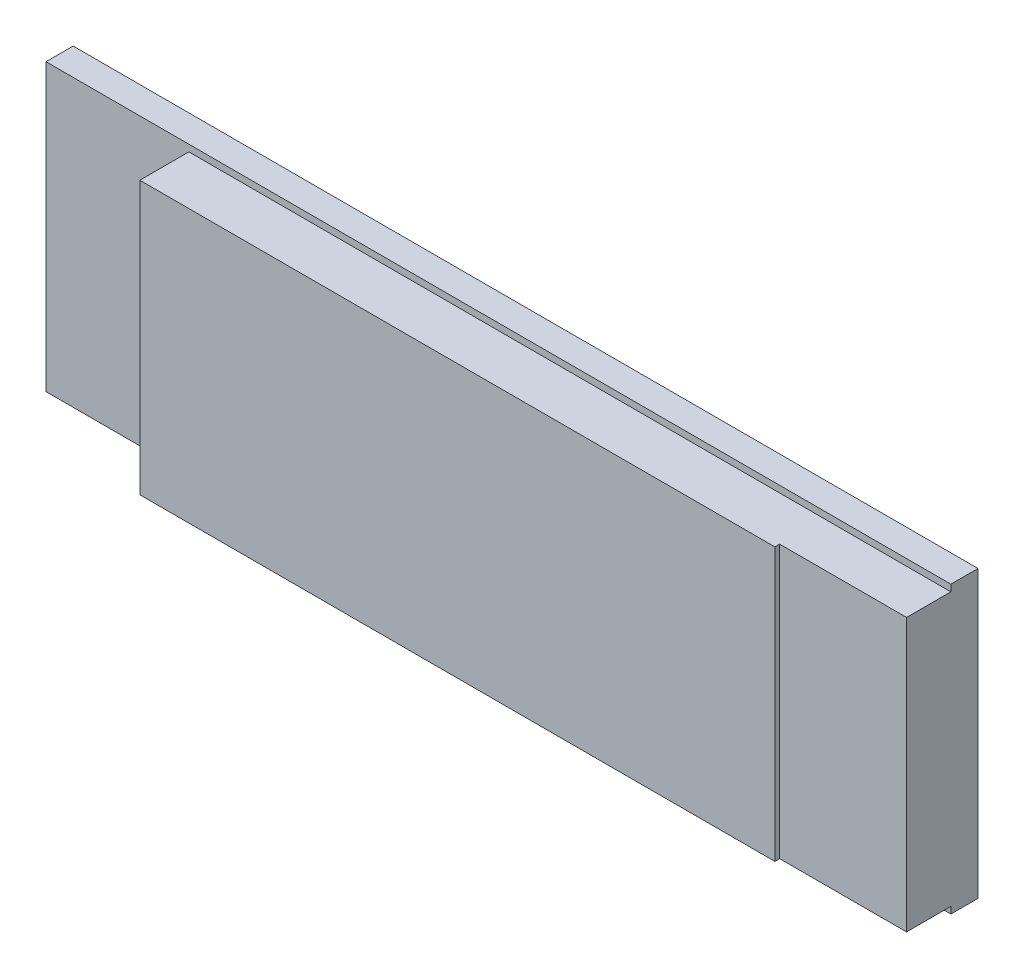
ISO-10303-21;
HEADER;
FILE_DESCRIPTION(('STEP AP214'),'2;1');
FILE_NAME('part.step','',(''),(''),'','','');
FILE_SCHEMA(('AUTOMOTIVE_DESIGN { 1 0 10303 214 1 1 1 1 }'));
ENDSEC;
DATA;
#1=APPLICATION_CONTEXT('core data for automotive mechanical design processes');
#2=APPLICATION_PROTOCOL_DEFINITION('international standard','automotive_design',2000,#1);
#3=PRODUCT_CONTEXT('',#1,'mechanical');
#4=PRODUCT('Part','Part','',(#3));
#5=PRODUCT_RELATED_PRODUCT_CATEGORY('part','',(#4));
#6=PRODUCT_DEFINITION_FORMATION('','',#4);
#7=PRODUCT_DEFINITION_CONTEXT('part definition',#1,'design');
#8=PRODUCT_DEFINITION('design','',#6,#7);
#9=PRODUCT_DEFINITION_SHAPE('','',#8);
#10=(LENGTH_UNIT() NAMED_UNIT(*) SI_UNIT(.MILLI.,.METRE.));
#11=(NAMED_UNIT(*) PLANE_ANGLE_UNIT() SI_UNIT($,.RADIAN.));
#12=(NAMED_UNIT(*) SI_UNIT($,.STERADIAN.) SOLID_ANGLE_UNIT());
#13=UNCERTAINTY_MEASURE_WITH_UNIT(LENGTH_MEASURE(1.E-05),#10,'distance_accuracy_value','');
#14=(GEOMETRIC_REPRESENTATION_CONTEXT(3) GLOBAL_UNCERTAINTY_ASSIGNED_CONTEXT((#13)) GLOBAL_UNIT_ASSIGNED_CONTEXT((#10,
#11,#12)) REPRESENTATION_CONTEXT('',''));
#15=CARTESIAN_POINT('',(0.,0.,0.));
#16=DIRECTION('',(0.,0.,1.));
#17=DIRECTION('',(1.,0.,0.));
#18=AXIS2_PLACEMENT_3D('',#15,#16,#17);
#19=CARTESIAN_POINT('',(0.,0.,1.14));
#20=DIRECTION('',(0.,0.,-1.));
#21=DIRECTION('',(-1.,0.,0.));
#22=AXIS2_PLACEMENT_3D('',#19,#20,#21);
#23=PLANE('',#22);
#24=DIRECTION('',(1.,0.,0.));
#25=VECTOR('',#24,1.);
#26=CARTESIAN_POINT('',(-13.,-5.72,1.14));
#27=LINE('',#26,#25);
#28=CARTESIAN_POINT('',(-13.,-5.72,1.14));
#29=VERTEX_POINT('',#28);
#30=CARTESIAN_POINT('',(19.,-5.72,1.14));
#31=VERTEX_POINT('',#30);
#32=EDGE_CURVE('E58',#29,#31,#27,.T.);
#33=ORIENTED_EDGE('',*,*,#32,.F.);
#34=DIRECTION('',(0.,-1.,0.));
#35=VECTOR('',#34,1.);
#36=CARTESIAN_POINT('',(-13.,5.72,1.14));
#37=LINE('',#36,#35);
#38=CARTESIAN_POINT('',(-13.,5.72,1.14));
#39=VERTEX_POINT('',#38);
#40=EDGE_CURVE('E142',#39,#29,#37,.T.);
#41=ORIENTED_EDGE('',*,*,#40,.F.);
#42=DIRECTION('',(-1.,0.,0.));
#43=VECTOR('',#42,1.);
#44=CARTESIAN_POINT('',(-13.,5.72,1.14));
#45=LINE('',#44,#43);
#46=CARTESIAN_POINT('',(19.,5.72,1.14));
#47=VERTEX_POINT('',#46);
#48=EDGE_CURVE('E169',#47,#39,#45,.T.);
#49=ORIENTED_EDGE('',*,*,#48,.F.);
#50=DIRECTION('',(0.,1.,0.));
#51=VECTOR('',#50,1.);
#52=CARTESIAN_POINT('',(19.,-6.,1.14));
#53=LINE('',#52,#51);
#54=CARTESIAN_POINT('',(19.,6.,1.14));
#55=VERTEX_POINT('',#54);
#56=EDGE_CURVE('E220',#47,#55,#53,.T.);
#57=ORIENTED_EDGE('',*,*,#56,.T.);
#58=DIRECTION('',(-1.,0.,0.));
#59=VECTOR('',#58,1.);
#60=CARTESIAN_POINT('',(-19.,6.,1.14));
#61=LINE('',#60,#59);
#62=CARTESIAN_POINT('',(-19.,6.,1.14));
#63=VERTEX_POINT('',#62);
#64=EDGE_CURVE('E219',#55,#63,#61,.T.);
#65=ORIENTED_EDGE('',*,*,#64,.T.);
#66=DIRECTION('',(0.,-1.,0.));
#67=VECTOR('',#66,1.);
#68=CARTESIAN_POINT('',(-19.,-6.,1.14));
#69=LINE('',#68,#67);
#70=CARTESIAN_POINT('',(-19.,-6.,1.14));
#71=VERTEX_POINT('',#70);
#72=EDGE_CURVE('E222',#63,#71,#69,.T.);
#73=ORIENTED_EDGE('',*,*,#72,.T.);
#74=DIRECTION('',(1.,0.,0.));
#75=VECTOR('',#74,1.);
#76=CARTESIAN_POINT('',(-19.,-6.,1.14));
#77=LINE('',#76,#75);
#78=CARTESIAN_POINT('',(19.,-6.,1.14));
#79=VERTEX_POINT('',#78);
#80=EDGE_CURVE('E224',#71,#79,#77,.T.);
#81=ORIENTED_EDGE('',*,*,#80,.T.);
#82=EDGE_CURVE('E217',#79,#31,#53,.T.);
#83=ORIENTED_EDGE('',*,*,#82,.T.);
#84=EDGE_LOOP('',(#33,#41,#49,#57,#65,#73,#81,#83));
#85=FACE_BOUND('',#84,.T.);
#86=ADVANCED_FACE('F35',(#85),#23,.F.);
#87=CARTESIAN_POINT('',(0.,0.,0.));
#88=DIRECTION('',(0.,0.,-1.));
#89=DIRECTION('',(-1.,0.,0.));
#90=AXIS2_PLACEMENT_3D('',#87,#88,#89);
#91=PLANE('',#90);
#92=DIRECTION('',(0.,1.,0.));
#93=VECTOR('',#92,1.);
#94=CARTESIAN_POINT('',(19.,-6.,0.));
#95=LINE('',#94,#93);
#96=CARTESIAN_POINT('',(19.,-6.,0.));
#97=VERTEX_POINT('',#96);
#98=CARTESIAN_POINT('',(19.,6.,0.));
#99=VERTEX_POINT('',#98);
#100=EDGE_CURVE('E216',#97,#99,#95,.T.);
#101=ORIENTED_EDGE('',*,*,#100,.F.);
#102=DIRECTION('',(1.,0.,0.));
#103=VECTOR('',#102,1.);
#104=CARTESIAN_POINT('',(-19.,-6.,0.));
#105=LINE('',#104,#103);
#106=CARTESIAN_POINT('',(-19.,-6.,0.));
#107=VERTEX_POINT('',#106);
#108=EDGE_CURVE('E233',#107,#97,#105,.T.);
#109=ORIENTED_EDGE('',*,*,#108,.F.);
#110=DIRECTION('',(0.,-1.,0.));
#111=VECTOR('',#110,1.);
#112=CARTESIAN_POINT('',(-19.,-6.,0.));
#113=LINE('',#112,#111);
#114=CARTESIAN_POINT('',(-19.,6.,0.));
#115=VERTEX_POINT('',#114);
#116=EDGE_CURVE('E231',#115,#107,#113,.T.);
#117=ORIENTED_EDGE('',*,*,#116,.F.);
#118=DIRECTION('',(-1.,0.,0.));
#119=VECTOR('',#118,1.);
#120=CARTESIAN_POINT('',(-19.,6.,0.));
#121=LINE('',#120,#119);
#122=EDGE_CURVE('E229',#99,#115,#121,.T.);
#123=ORIENTED_EDGE('',*,*,#122,.F.);
#124=EDGE_LOOP('',(#101,#109,#117,#123));
#125=FACE_BOUND('',#124,.T.);
#126=DIRECTION('',(-1.,0.,0.));
#127=VECTOR('',#126,1.);
#128=CARTESIAN_POINT('',(-9.78000000000001,-2.72,0.));
#129=LINE('',#128,#127);
#130=CARTESIAN_POINT('',(-8.48000000000001,-2.72,0.));
#131=VERTEX_POINT('',#130);
#132=CARTESIAN_POINT('',(-9.78000000000001,-2.72,0.));
#133=VERTEX_POINT('',#132);
#134=EDGE_CURVE('E201',#131,#133,#129,.T.);
#135=ORIENTED_EDGE('',*,*,#134,.F.);
#136=DIRECTION('',(0.,-1.,0.));
#137=VECTOR('',#136,1.);
#138=CARTESIAN_POINT('',(-8.48000000000001,-2.72,0.));
#139=LINE('',#138,#137);
#140=CARTESIAN_POINT('',(-8.48000000000001,0.12,0.));
#141=VERTEX_POINT('',#140);
#142=EDGE_CURVE('E187',#141,#131,#139,.T.);
#143=ORIENTED_EDGE('',*,*,#142,.F.);
#144=DIRECTION('',(1.,0.,0.));
#145=VECTOR('',#144,1.);
#146=CARTESIAN_POINT('',(-9.78000000000001,0.12,0.));
#147=LINE('',#146,#145);
#148=CARTESIAN_POINT('',(-9.78000000000001,0.12,0.));
#149=VERTEX_POINT('',#148);
#150=EDGE_CURVE('E192',#149,#141,#147,.T.);
#151=ORIENTED_EDGE('',*,*,#150,.F.);
#152=DIRECTION('',(0.,1.,0.));
#153=VECTOR('',#152,1.);
#154=CARTESIAN_POINT('',(-9.78000000000001,-2.72,0.));
#155=LINE('',#154,#153);
#156=EDGE_CURVE('E203',#133,#149,#155,.T.);
#157=ORIENTED_EDGE('',*,*,#156,.F.);
#158=EDGE_LOOP('',(#135,#143,#151,#157));
#159=FACE_BOUND('',#158,.T.);
#160=ADVANCED_FACE('F251',(#125,#159),#91,.T.);
#161=CARTESIAN_POINT('',(19.,-6.,1.14));
#162=DIRECTION('',(-1.,0.,0.));
#163=DIRECTION('',(0.,0.,1.));
#164=AXIS2_PLACEMENT_3D('',#161,#162,#163);
#165=PLANE('',#164);
#166=ORIENTED_EDGE('',*,*,#100,.T.);
#167=DIRECTION('',(0.,0.,-1.));
#168=VECTOR('',#167,1.);
#169=CARTESIAN_POINT('',(19.,6.,1.14));
#170=LINE('',#169,#168);
#171=EDGE_CURVE('E11',#55,#99,#170,.T.);
#172=ORIENTED_EDGE('',*,*,#171,.F.);
#173=ORIENTED_EDGE('',*,*,#56,.F.);
#174=DIRECTION('',(0.,0.,-1.));
#175=VECTOR('',#174,1.);
#176=CARTESIAN_POINT('',(19.,5.72,3.));
#177=LINE('',#176,#175);
#178=CARTESIAN_POINT('',(19.,5.72,3.));
#179=VERTEX_POINT('',#178);
#180=EDGE_CURVE('E184',#179,#47,#177,.T.);
#181=ORIENTED_EDGE('',*,*,#180,.F.);
#182=DIRECTION('',(0.,1.,0.));
#183=VECTOR('',#182,1.);
#184=CARTESIAN_POINT('',(19.,5.72,3.));
#185=LINE('',#184,#183);
#186=CARTESIAN_POINT('',(19.,-5.72,3.));
#187=VERTEX_POINT('',#186);
#188=EDGE_CURVE('E170',#187,#179,#185,.T.);
#189=ORIENTED_EDGE('',*,*,#188,.F.);
#190=DIRECTION('',(0.,0.,-1.));
#191=VECTOR('',#190,1.);
#192=CARTESIAN_POINT('',(19.,-5.72,3.));
#193=LINE('',#192,#191);
#194=EDGE_CURVE('E145',#187,#31,#193,.T.);
#195=ORIENTED_EDGE('',*,*,#194,.T.);
#196=ORIENTED_EDGE('',*,*,#82,.F.);
#197=DIRECTION('',(0.,0.,-1.));
#198=VECTOR('',#197,1.);
#199=CARTESIAN_POINT('',(19.,-6.,1.14));
#200=LINE('',#199,#198);
#201=EDGE_CURVE('E226',#79,#97,#200,.T.);
#202=ORIENTED_EDGE('',*,*,#201,.T.);
#203=EDGE_LOOP('',(#166,#172,#173,#181,#189,#195,#196,#202));
#204=FACE_BOUND('',#203,.T.);
#205=ADVANCED_FACE('F37',(#204),#165,.F.);
#206=CARTESIAN_POINT('',(-19.,6.,1.14));
#207=DIRECTION('',(0.,-1.,0.));
#208=DIRECTION('',(0.,0.,-1.));
#209=AXIS2_PLACEMENT_3D('',#206,#207,#208);
#210=PLANE('',#209);
#211=ORIENTED_EDGE('',*,*,#122,.T.);
#212=DIRECTION('',(0.,0.,-1.));
#213=VECTOR('',#212,1.);
#214=CARTESIAN_POINT('',(-19.,6.,1.14));
#215=LINE('',#214,#213);
#216=EDGE_CURVE('E43',#63,#115,#215,.T.);
#217=ORIENTED_EDGE('',*,*,#216,.F.);
#218=ORIENTED_EDGE('',*,*,#64,.F.);
#219=ORIENTED_EDGE('',*,*,#171,.T.);
#220=EDGE_LOOP('',(#211,#217,#218,#219));
#221=FACE_BOUND('',#220,.T.);
#222=ADVANCED_FACE('F270',(#221),#210,.F.);
#223=CARTESIAN_POINT('',(-19.,-6.,1.14));
#224=DIRECTION('',(1.,0.,0.));
#225=DIRECTION('',(0.,0.,-1.));
#226=AXIS2_PLACEMENT_3D('',#223,#224,#225);
#227=PLANE('',#226);
#228=ORIENTED_EDGE('',*,*,#116,.T.);
#229=DIRECTION('',(0.,0.,-1.));
#230=VECTOR('',#229,1.);
#231=CARTESIAN_POINT('',(-19.,-6.,1.14));
#232=LINE('',#231,#230);
#233=EDGE_CURVE('E237',#71,#107,#232,.T.);
#234=ORIENTED_EDGE('',*,*,#233,.F.);
#235=ORIENTED_EDGE('',*,*,#72,.F.);
#236=ORIENTED_EDGE('',*,*,#216,.T.);
#237=EDGE_LOOP('',(#228,#234,#235,#236));
#238=FACE_BOUND('',#237,.T.);
#239=ADVANCED_FACE('F244',(#238),#227,.F.);
#240=CARTESIAN_POINT('',(-19.,-6.,1.14));
#241=DIRECTION('',(0.,1.,0.));
#242=DIRECTION('',(0.,0.,1.));
#243=AXIS2_PLACEMENT_3D('',#240,#241,#242);
#244=PLANE('',#243);
#245=ORIENTED_EDGE('',*,*,#108,.T.);
#246=ORIENTED_EDGE('',*,*,#201,.F.);
#247=ORIENTED_EDGE('',*,*,#80,.F.);
#248=ORIENTED_EDGE('',*,*,#233,.T.);
#249=EDGE_LOOP('',(#245,#246,#247,#248));
#250=FACE_BOUND('',#249,.T.);
#251=ADVANCED_FACE('F255',(#250),#244,.F.);
#252=CARTESIAN_POINT('',(-8.48000000000001,-2.72,-1.17));
#253=DIRECTION('',(-1.,0.,0.));
#254=DIRECTION('',(0.,0.,1.));
#255=AXIS2_PLACEMENT_3D('',#252,#253,#254);
#256=PLANE('',#255);
#257=ORIENTED_EDGE('',*,*,#142,.T.);
#258=DIRECTION('',(0.,0.,1.));
#259=VECTOR('',#258,1.);
#260=CARTESIAN_POINT('',(-8.48000000000001,-2.72,-1.17));
#261=LINE('',#260,#259);
#262=CARTESIAN_POINT('',(-8.48000000000001,-2.72,-1.17));
#263=VERTEX_POINT('',#262);
#264=EDGE_CURVE('E214',#263,#131,#261,.T.);
#265=ORIENTED_EDGE('',*,*,#264,.F.);
#266=DIRECTION('',(0.,-1.,0.));
#267=VECTOR('',#266,1.);
#268=CARTESIAN_POINT('',(-8.48000000000001,-2.72,-1.17));
#269=LINE('',#268,#267);
#270=CARTESIAN_POINT('',(-8.48000000000001,0.12,-1.17));
#271=VERTEX_POINT('',#270);
#272=EDGE_CURVE('E188',#271,#263,#269,.T.);
#273=ORIENTED_EDGE('',*,*,#272,.F.);
#274=DIRECTION('',(0.,0.,1.));
#275=VECTOR('',#274,1.);
#276=CARTESIAN_POINT('',(-8.48000000000001,0.12,-1.17));
#277=LINE('',#276,#275);
#278=EDGE_CURVE('E198',#271,#141,#277,.T.);
#279=ORIENTED_EDGE('',*,*,#278,.T.);
#280=EDGE_LOOP('',(#257,#265,#273,#279));
#281=FACE_BOUND('',#280,.T.);
#282=ADVANCED_FACE('F284',(#281),#256,.F.);
#283=CARTESIAN_POINT('',(-9.78000000000001,-2.72,-1.17));
#284=DIRECTION('',(0.,1.,0.));
#285=DIRECTION('',(0.,0.,1.));
#286=AXIS2_PLACEMENT_3D('',#283,#284,#285);
#287=PLANE('',#286);
#288=ORIENTED_EDGE('',*,*,#134,.T.);
#289=DIRECTION('',(0.,0.,1.));
#290=VECTOR('',#289,1.);
#291=CARTESIAN_POINT('',(-9.78000000000001,-2.72,-1.17));
#292=LINE('',#291,#290);
#293=CARTESIAN_POINT('',(-9.78000000000001,-2.72,-1.17));
#294=VERTEX_POINT('',#293);
#295=EDGE_CURVE('E211',#294,#133,#292,.T.);
#296=ORIENTED_EDGE('',*,*,#295,.F.);
#297=DIRECTION('',(-1.,0.,0.));
#298=VECTOR('',#297,1.);
#299=CARTESIAN_POINT('',(-9.78000000000001,-2.72,-1.17));
#300=LINE('',#299,#298);
#301=EDGE_CURVE('E191',#263,#294,#300,.T.);
#302=ORIENTED_EDGE('',*,*,#301,.F.);
#303=ORIENTED_EDGE('',*,*,#264,.T.);
#304=EDGE_LOOP('',(#288,#296,#302,#303));
#305=FACE_BOUND('',#304,.T.);
#306=ADVANCED_FACE('F291',(#305),#287,.F.);
#307=CARTESIAN_POINT('',(-9.78000000000001,-2.72,-1.17));
#308=DIRECTION('',(1.,0.,0.));
#309=DIRECTION('',(0.,0.,-1.));
#310=AXIS2_PLACEMENT_3D('',#307,#308,#309);
#311=PLANE('',#310);
#312=ORIENTED_EDGE('',*,*,#156,.T.);
#313=DIRECTION('',(0.,0.,1.));
#314=VECTOR('',#313,1.);
#315=CARTESIAN_POINT('',(-9.78000000000001,0.12,-1.17));
#316=LINE('',#315,#314);
#317=CARTESIAN_POINT('',(-9.78000000000001,0.12,-1.17));
#318=VERTEX_POINT('',#317);
#319=EDGE_CURVE('E209',#318,#149,#316,.T.);
#320=ORIENTED_EDGE('',*,*,#319,.F.);
#321=DIRECTION('',(0.,1.,0.));
#322=VECTOR('',#321,1.);
#323=CARTESIAN_POINT('',(-9.78000000000001,-2.72,-1.17));
#324=LINE('',#323,#322);
#325=EDGE_CURVE('E194',#294,#318,#324,.T.);
#326=ORIENTED_EDGE('',*,*,#325,.F.);
#327=ORIENTED_EDGE('',*,*,#295,.T.);
#328=EDGE_LOOP('',(#312,#320,#326,#327));
#329=FACE_BOUND('',#328,.T.);
#330=ADVANCED_FACE('F296',(#329),#311,.F.);
#331=CARTESIAN_POINT('',(-9.78000000000001,0.12,-1.17));
#332=DIRECTION('',(0.,-1.,0.));
#333=DIRECTION('',(1.,0.,0.));
#334=AXIS2_PLACEMENT_3D('',#331,#332,#333);
#335=PLANE('',#334);
#336=ORIENTED_EDGE('',*,*,#150,.T.);
#337=ORIENTED_EDGE('',*,*,#278,.F.);
#338=DIRECTION('',(1.,0.,0.));
#339=VECTOR('',#338,1.);
#340=CARTESIAN_POINT('',(-9.78000000000001,0.12,-1.17));
#341=LINE('',#340,#339);
#342=EDGE_CURVE('E196',#318,#271,#341,.T.);
#343=ORIENTED_EDGE('',*,*,#342,.F.);
#344=ORIENTED_EDGE('',*,*,#319,.T.);
#345=EDGE_LOOP('',(#336,#337,#343,#344));
#346=FACE_BOUND('',#345,.T.);
#347=ADVANCED_FACE('F313',(#346),#335,.F.);
#348=CARTESIAN_POINT('',(0.,0.,-1.17));
#349=DIRECTION('',(0.,0.,-1.));
#350=DIRECTION('',(-1.,0.,0.));
#351=AXIS2_PLACEMENT_3D('',#348,#349,#350);
#352=PLANE('',#351);
#353=ORIENTED_EDGE('',*,*,#272,.T.);
#354=ORIENTED_EDGE('',*,*,#301,.T.);
#355=ORIENTED_EDGE('',*,*,#325,.T.);
#356=ORIENTED_EDGE('',*,*,#342,.T.);
#357=EDGE_LOOP('',(#353,#354,#355,#356));
#358=FACE_BOUND('',#357,.T.);
#359=ADVANCED_FACE('F311',(#358),#352,.T.);
#360=CARTESIAN_POINT('',(-13.,5.72,3.));
#361=DIRECTION('',(0.,-1.,0.));
#362=DIRECTION('',(0.,0.,-1.));
#363=AXIS2_PLACEMENT_3D('',#360,#361,#362);
#364=PLANE('',#363);
#365=ORIENTED_EDGE('',*,*,#48,.T.);
#366=DIRECTION('',(0.,0.,-1.));
#367=VECTOR('',#366,1.);
#368=CARTESIAN_POINT('',(-13.,5.72,3.));
#369=LINE('',#368,#367);
#370=CARTESIAN_POINT('',(-13.,5.72,3.2));
#371=VERTEX_POINT('',#370);
#372=EDGE_CURVE('E144',#371,#39,#369,.T.);
#373=ORIENTED_EDGE('',*,*,#372,.F.);
#374=DIRECTION('',(-1.,0.,0.));
#375=VECTOR('',#374,1.);
#376=CARTESIAN_POINT('',(-13.,5.72,3.2));
#377=LINE('',#376,#375);
#378=CARTESIAN_POINT('',(13.67,5.72,3.2));
#379=VERTEX_POINT('',#378);
#380=EDGE_CURVE('E159',#379,#371,#377,.T.);
#381=ORIENTED_EDGE('',*,*,#380,.F.);
#382=DIRECTION('',(0.,0.,-1.));
#383=VECTOR('',#382,1.);
#384=CARTESIAN_POINT('',(13.67,5.72,3.2));
#385=LINE('',#384,#383);
#386=CARTESIAN_POINT('',(13.67,5.72,3.));
#387=VERTEX_POINT('',#386);
#388=EDGE_CURVE('E164',#379,#387,#385,.T.);
#389=ORIENTED_EDGE('',*,*,#388,.T.);
#390=DIRECTION('',(-1.,0.,0.));
#391=VECTOR('',#390,1.);
#392=CARTESIAN_POINT('',(-13.,5.72,3.));
#393=LINE('',#392,#391);
#394=EDGE_CURVE('E173',#179,#387,#393,.T.);
#395=ORIENTED_EDGE('',*,*,#394,.F.);
#396=ORIENTED_EDGE('',*,*,#180,.T.);
#397=EDGE_LOOP('',(#365,#373,#381,#389,#395,#396));
#398=FACE_BOUND('',#397,.T.);
#399=ADVANCED_FACE('F269',(#398),#364,.F.);
#400=CARTESIAN_POINT('',(-13.,5.72,3.));
#401=DIRECTION('',(1.,0.,0.));
#402=DIRECTION('',(0.,0.,-1.));
#403=AXIS2_PLACEMENT_3D('',#400,#401,#402);
#404=PLANE('',#403);
#405=ORIENTED_EDGE('',*,*,#40,.T.);
#406=DIRECTION('',(0.,0.,-1.));
#407=VECTOR('',#406,1.);
#408=CARTESIAN_POINT('',(-13.,-5.72,3.));
#409=LINE('',#408,#407);
#410=CARTESIAN_POINT('',(-13.,-5.72,3.2));
#411=VERTEX_POINT('',#410);
#412=EDGE_CURVE('E136',#411,#29,#409,.T.);
#413=ORIENTED_EDGE('',*,*,#412,.F.);
#414=DIRECTION('',(0.,-1.,0.));
#415=VECTOR('',#414,1.);
#416=CARTESIAN_POINT('',(-13.,5.72,3.2));
#417=LINE('',#416,#415);
#418=EDGE_CURVE('E141',#371,#411,#417,.T.);
#419=ORIENTED_EDGE('',*,*,#418,.F.);
#420=ORIENTED_EDGE('',*,*,#372,.T.);
#421=EDGE_LOOP('',(#405,#413,#419,#420));
#422=FACE_BOUND('',#421,.T.);
#423=ADVANCED_FACE('F138',(#422),#404,.F.);
#424=CARTESIAN_POINT('',(-13.,-5.72,3.));
#425=DIRECTION('',(0.,1.,0.));
#426=DIRECTION('',(0.,0.,1.));
#427=AXIS2_PLACEMENT_3D('',#424,#425,#426);
#428=PLANE('',#427);
#429=ORIENTED_EDGE('',*,*,#32,.T.);
#430=ORIENTED_EDGE('',*,*,#194,.F.);
#431=DIRECTION('',(1.,0.,0.));
#432=VECTOR('',#431,1.);
#433=CARTESIAN_POINT('',(-13.,-5.72,3.));
#434=LINE('',#433,#432);
#435=CARTESIAN_POINT('',(13.67,-5.72,3.));
#436=VERTEX_POINT('',#435);
#437=EDGE_CURVE('E175',#436,#187,#434,.T.);
#438=ORIENTED_EDGE('',*,*,#437,.F.);
#439=DIRECTION('',(0.,0.,-1.));
#440=VECTOR('',#439,1.);
#441=CARTESIAN_POINT('',(13.67,-5.72,3.2));
#442=LINE('',#441,#440);
#443=CARTESIAN_POINT('',(13.67,-5.72,3.2));
#444=VERTEX_POINT('',#443);
#445=EDGE_CURVE('E151',#444,#436,#442,.T.);
#446=ORIENTED_EDGE('',*,*,#445,.F.);
#447=DIRECTION('',(1.,0.,0.));
#448=VECTOR('',#447,1.);
#449=CARTESIAN_POINT('',(-13.,-5.72,3.2));
#450=LINE('',#449,#448);
#451=EDGE_CURVE('E148',#411,#444,#450,.T.);
#452=ORIENTED_EDGE('',*,*,#451,.F.);
#453=ORIENTED_EDGE('',*,*,#412,.T.);
#454=EDGE_LOOP('',(#429,#430,#438,#446,#452,#453));
#455=FACE_BOUND('',#454,.T.);
#456=ADVANCED_FACE('F149',(#455),#428,.F.);
#457=CARTESIAN_POINT('',(0.,0.,3.));
#458=DIRECTION('',(0.,0.,1.));
#459=DIRECTION('',(1.,0.,0.));
#460=AXIS2_PLACEMENT_3D('',#457,#458,#459);
#461=PLANE('',#460);
#462=DIRECTION('',(0.,1.,0.));
#463=VECTOR('',#462,1.);
#464=CARTESIAN_POINT('',(13.67,5.72,3.));
#465=LINE('',#464,#463);
#466=EDGE_CURVE('E50',#436,#387,#465,.T.);
#467=ORIENTED_EDGE('',*,*,#466,.F.);
#468=ORIENTED_EDGE('',*,*,#437,.T.);
#469=ORIENTED_EDGE('',*,*,#188,.T.);
#470=ORIENTED_EDGE('',*,*,#394,.T.);
#471=EDGE_LOOP('',(#467,#468,#469,#470));
#472=FACE_BOUND('',#471,.T.);
#473=ADVANCED_FACE('F264',(#472),#461,.T.);
#474=CARTESIAN_POINT('',(13.67,5.72,3.2));
#475=DIRECTION('',(-1.,0.,0.));
#476=DIRECTION('',(0.,0.,1.));
#477=AXIS2_PLACEMENT_3D('',#474,#475,#476);
#478=PLANE('',#477);
#479=ORIENTED_EDGE('',*,*,#466,.T.);
#480=ORIENTED_EDGE('',*,*,#388,.F.);
#481=DIRECTION('',(0.,1.,0.));
#482=VECTOR('',#481,1.);
#483=CARTESIAN_POINT('',(13.67,5.72,3.2));
#484=LINE('',#483,#482);
#485=EDGE_CURVE('E154',#444,#379,#484,.T.);
#486=ORIENTED_EDGE('',*,*,#485,.F.);
#487=ORIENTED_EDGE('',*,*,#445,.T.);
#488=EDGE_LOOP('',(#479,#480,#486,#487));
#489=FACE_BOUND('',#488,.T.);
#490=ADVANCED_FACE('F268',(#489),#478,.F.);
#491=CARTESIAN_POINT('',(0.,0.,3.2));
#492=DIRECTION('',(0.,0.,1.));
#493=DIRECTION('',(1.,0.,0.));
#494=AXIS2_PLACEMENT_3D('',#491,#492,#493);
#495=PLANE('',#494);
#496=ORIENTED_EDGE('',*,*,#418,.T.);
#497=ORIENTED_EDGE('',*,*,#451,.T.);
#498=ORIENTED_EDGE('',*,*,#485,.T.);
#499=ORIENTED_EDGE('',*,*,#380,.T.);
#500=EDGE_LOOP('',(#496,#497,#498,#499));
#501=FACE_BOUND('',#500,.T.);
#502=ADVANCED_FACE('F157',(#501),#495,.T.);
#503=CLOSED_SHELL('',(#86,#160,#205,#222,#239,#251,#282,#306,#330,#347,#359,#399,#423,#456,#473,
#490,#502));
#504=MANIFOLD_SOLID_BREP('B2',#503);
#505=ADVANCED_BREP_SHAPE_REPRESENTATION('',(#18,#504),#14);
#506=SHAPE_DEFINITION_REPRESENTATION(#9,#505);
ENDSEC;
END-ISO-10303-21;
